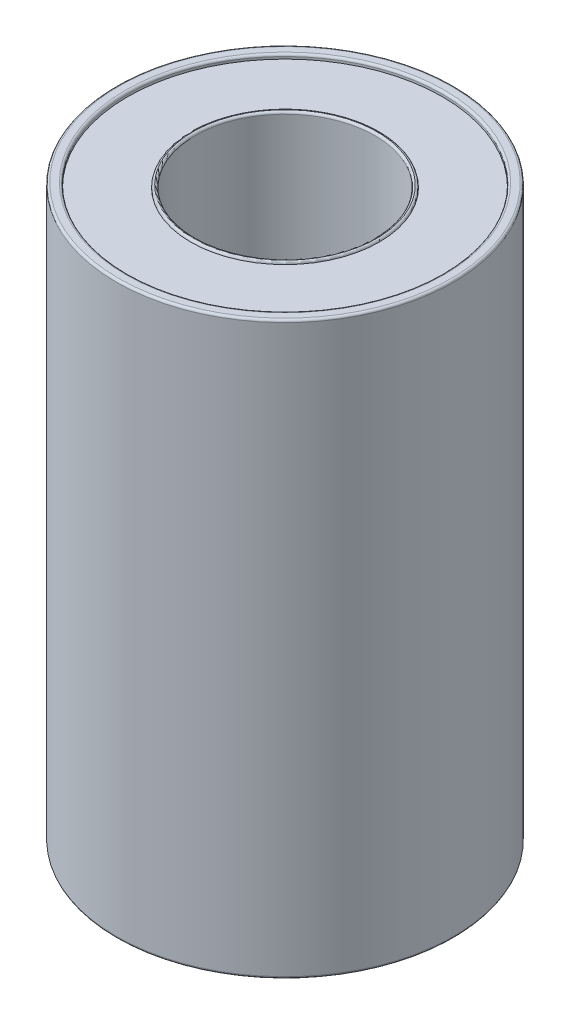
ISO-10303-21;
HEADER;
FILE_DESCRIPTION(('STEP AP214'),'2;1');
FILE_NAME('part.step','',(''),(''),'','','');
FILE_SCHEMA(('AUTOMOTIVE_DESIGN { 1 0 10303 214 1 1 1 1 }'));
ENDSEC;
DATA;
#1=APPLICATION_CONTEXT('core data for automotive mechanical design processes');
#2=APPLICATION_PROTOCOL_DEFINITION('international standard','automotive_design',2000,#1);
#3=PRODUCT_CONTEXT('',#1,'mechanical');
#4=PRODUCT('Part','Part','',(#3));
#5=PRODUCT_RELATED_PRODUCT_CATEGORY('part','',(#4));
#6=PRODUCT_DEFINITION_FORMATION('','',#4);
#7=PRODUCT_DEFINITION_CONTEXT('part definition',#1,'design');
#8=PRODUCT_DEFINITION('design','',#6,#7);
#9=PRODUCT_DEFINITION_SHAPE('','',#8);
#10=(LENGTH_UNIT() NAMED_UNIT(*) SI_UNIT(.MILLI.,.METRE.));
#11=(NAMED_UNIT(*) PLANE_ANGLE_UNIT() SI_UNIT($,.RADIAN.));
#12=(NAMED_UNIT(*) SI_UNIT($,.STERADIAN.) SOLID_ANGLE_UNIT());
#13=UNCERTAINTY_MEASURE_WITH_UNIT(LENGTH_MEASURE(1.E-05),#10,'distance_accuracy_value','');
#14=(GEOMETRIC_REPRESENTATION_CONTEXT(3) GLOBAL_UNCERTAINTY_ASSIGNED_CONTEXT((#13)) GLOBAL_UNIT_ASSIGNED_CONTEXT((#10,
#11,#12)) REPRESENTATION_CONTEXT('',''));
#15=CARTESIAN_POINT('',(0.,0.,0.));
#16=DIRECTION('',(0.,0.,1.));
#17=DIRECTION('',(1.,0.,0.));
#18=AXIS2_PLACEMENT_3D('',#15,#16,#17);
#19=CARTESIAN_POINT('',(0.,12.5,0.));
#20=DIRECTION('',(0.,1.,0.));
#21=DIRECTION('',(0.,0.,1.));
#22=AXIS2_PLACEMENT_3D('',#19,#20,#21);
#23=PLANE('',#22);
#24=CARTESIAN_POINT('',(0.,12.5,0.));
#25=DIRECTION('',(0.,1.,0.));
#26=DIRECTION('',(0.,0.,1.));
#27=AXIS2_PLACEMENT_3D('',#24,#25,#26);
#28=CIRCLE('',#27,7.);
#29=CARTESIAN_POINT('',(0.,12.5,7.));
#30=VERTEX_POINT('',#29);
#31=EDGE_CURVE('E83',#30,#30,#28,.F.);
#32=ORIENTED_EDGE('',*,*,#31,.F.);
#33=EDGE_LOOP('',(#32));
#34=FACE_BOUND('',#33,.T.);
#35=CARTESIAN_POINT('',(0.,12.5,0.));
#36=DIRECTION('',(0.,1.,0.));
#37=DIRECTION('',(0.,0.,1.));
#38=AXIS2_PLACEMENT_3D('',#35,#36,#37);
#39=CIRCLE('',#38,4.2);
#40=CARTESIAN_POINT('',(0.,12.5,4.2));
#41=VERTEX_POINT('',#40);
#42=EDGE_CURVE('E92',#41,#41,#39,.T.);
#43=ORIENTED_EDGE('',*,*,#42,.F.);
#44=EDGE_LOOP('',(#43));
#45=FACE_BOUND('',#44,.T.);
#46=ADVANCED_FACE('F37',(#34,#45),#23,.T.);
#47=CARTESIAN_POINT('',(0.,-12.5,0.));
#48=DIRECTION('',(0.,1.,0.));
#49=DIRECTION('',(0.,0.,1.));
#50=AXIS2_PLACEMENT_3D('',#47,#48,#49);
#51=PLANE('',#50);
#52=CARTESIAN_POINT('',(0.,-12.5,0.));
#53=DIRECTION('',(0.,1.,0.));
#54=DIRECTION('',(0.,0.,1.));
#55=AXIS2_PLACEMENT_3D('',#52,#53,#54);
#56=CIRCLE('',#55,4.2);
#57=CARTESIAN_POINT('',(0.,-12.5,4.2));
#58=VERTEX_POINT('',#57);
#59=EDGE_CURVE('E82',#58,#58,#56,.T.);
#60=ORIENTED_EDGE('',*,*,#59,.T.);
#61=EDGE_LOOP('',(#60));
#62=FACE_BOUND('',#61,.T.);
#63=CARTESIAN_POINT('',(0.,-12.5,0.));
#64=DIRECTION('',(0.,1.,0.));
#65=DIRECTION('',(0.,0.,1.));
#66=AXIS2_PLACEMENT_3D('',#63,#64,#65);
#67=CIRCLE('',#66,7.);
#68=CARTESIAN_POINT('',(0.,-12.5,7.));
#69=VERTEX_POINT('',#68);
#70=EDGE_CURVE('E96',#69,#69,#67,.T.);
#71=ORIENTED_EDGE('',*,*,#70,.F.);
#72=EDGE_LOOP('',(#71));
#73=FACE_BOUND('',#72,.T.);
#74=ADVANCED_FACE('F114',(#62,#73),#51,.F.);
#75=CARTESIAN_POINT('',(0.,-12.5,0.));
#76=DIRECTION('',(0.,1.,0.));
#77=DIRECTION('',(0.,0.,1.));
#78=AXIS2_PLACEMENT_3D('',#75,#76,#77);
#79=CYLINDRICAL_SURFACE('',#78,4.);
#80=CARTESIAN_POINT('',(0.,-12.5,0.));
#81=DIRECTION('',(0.,-1.,0.));
#82=DIRECTION('',(0.,0.,-1.));
#83=AXIS2_PLACEMENT_3D('',#80,#81,#82);
#84=CIRCLE('',#83,4.);
#85=CARTESIAN_POINT('',(0.,-12.5,-4.));
#86=VERTEX_POINT('',#85);
#87=EDGE_CURVE('E77',#86,#86,#84,.T.);
#88=ORIENTED_EDGE('',*,*,#87,.T.);
#89=EDGE_LOOP('',(#88));
#90=FACE_BOUND('',#89,.T.);
#91=CARTESIAN_POINT('',(0.,12.5,0.));
#92=DIRECTION('',(0.,1.,0.));
#93=DIRECTION('',(0.,0.,1.));
#94=AXIS2_PLACEMENT_3D('',#91,#92,#93);
#95=CIRCLE('',#94,4.);
#96=CARTESIAN_POINT('',(0.,12.5,4.));
#97=VERTEX_POINT('',#96);
#98=EDGE_CURVE('E87',#97,#97,#95,.T.);
#99=ORIENTED_EDGE('',*,*,#98,.T.);
#100=EDGE_LOOP('',(#99));
#101=FACE_BOUND('',#100,.T.);
#102=ADVANCED_FACE('F127',(#90,#101),#79,.F.);
#103=CARTESIAN_POINT('',(0.,12.5,0.));
#104=DIRECTION('',(0.,1.,0.));
#105=DIRECTION('',(0.,0.,1.));
#106=AXIS2_PLACEMENT_3D('',#103,#104,#105);
#107=TOROIDAL_SURFACE('',#106,4.1,0.1);
#108=ORIENTED_EDGE('',*,*,#98,.F.);
#109=EDGE_LOOP('',(#108));
#110=FACE_BOUND('',#109,.T.);
#111=CARTESIAN_POINT('',(0.,12.6,0.));
#112=DIRECTION('',(0.,1.,0.));
#113=DIRECTION('',(0.,0.,1.));
#114=AXIS2_PLACEMENT_3D('',#111,#112,#113);
#115=CIRCLE('',#114,4.1);
#116=CARTESIAN_POINT('',(0.,12.6,4.1));
#117=VERTEX_POINT('',#116);
#118=EDGE_CURVE('E88',#117,#117,#115,.F.);
#119=ORIENTED_EDGE('',*,*,#118,.F.);
#120=EDGE_LOOP('',(#119));
#121=FACE_BOUND('',#120,.T.);
#122=ADVANCED_FACE('F122',(#110,#121),#107,.T.);
#123=CARTESIAN_POINT('',(0.,12.5,0.));
#124=DIRECTION('',(0.,1.,0.));
#125=DIRECTION('',(0.,0.,1.));
#126=AXIS2_PLACEMENT_3D('',#123,#124,#125);
#127=TOROIDAL_SURFACE('',#126,4.1,0.1);
#128=ORIENTED_EDGE('',*,*,#42,.T.);
#129=EDGE_LOOP('',(#128));
#130=FACE_BOUND('',#129,.T.);
#131=ORIENTED_EDGE('',*,*,#118,.T.);
#132=EDGE_LOOP('',(#131));
#133=FACE_BOUND('',#132,.T.);
#134=ADVANCED_FACE('F118',(#130,#133),#127,.T.);
#135=CARTESIAN_POINT('',(0.,-12.5,0.));
#136=DIRECTION('',(0.,-1.,0.));
#137=DIRECTION('',(0.,0.,-1.));
#138=AXIS2_PLACEMENT_3D('',#135,#136,#137);
#139=TOROIDAL_SURFACE('',#138,4.1,0.1);
#140=ORIENTED_EDGE('',*,*,#87,.F.);
#141=EDGE_LOOP('',(#140));
#142=FACE_BOUND('',#141,.T.);
#143=CARTESIAN_POINT('',(0.,-12.6,0.));
#144=DIRECTION('',(0.,-1.,0.));
#145=DIRECTION('',(0.,0.,-1.));
#146=AXIS2_PLACEMENT_3D('',#143,#144,#145);
#147=CIRCLE('',#146,4.1);
#148=CARTESIAN_POINT('',(0.,-12.6,-4.1));
#149=VERTEX_POINT('',#148);
#150=EDGE_CURVE('E78',#149,#149,#147,.F.);
#151=ORIENTED_EDGE('',*,*,#150,.F.);
#152=EDGE_LOOP('',(#151));
#153=FACE_BOUND('',#152,.T.);
#154=ADVANCED_FACE('F121',(#142,#153),#139,.T.);
#155=CARTESIAN_POINT('',(0.,-12.5,0.));
#156=DIRECTION('',(0.,-1.,0.));
#157=DIRECTION('',(0.,0.,-1.));
#158=AXIS2_PLACEMENT_3D('',#155,#156,#157);
#159=TOROIDAL_SURFACE('',#158,4.1,0.1);
#160=ORIENTED_EDGE('',*,*,#150,.T.);
#161=EDGE_LOOP('',(#160));
#162=FACE_BOUND('',#161,.T.);
#163=ORIENTED_EDGE('',*,*,#59,.F.);
#164=EDGE_LOOP('',(#163));
#165=FACE_BOUND('',#164,.T.);
#166=ADVANCED_FACE('F138',(#162,#165),#159,.T.);
#167=CARTESIAN_POINT('',(0.,12.7,0.));
#168=DIRECTION('',(0.,-1.,0.));
#169=DIRECTION('',(0.,0.,-1.));
#170=AXIS2_PLACEMENT_3D('',#167,#168,#169);
#171=CYLINDRICAL_SURFACE('',#170,7.);
#172=CARTESIAN_POINT('',(0.,-12.6,0.));
#173=DIRECTION('',(0.,1.,0.));
#174=DIRECTION('',(0.,0.,1.));
#175=AXIS2_PLACEMENT_3D('',#172,#173,#174);
#176=CIRCLE('',#175,7.);
#177=CARTESIAN_POINT('',(0.,-12.6,7.));
#178=VERTEX_POINT('',#177);
#179=EDGE_CURVE('E45',#178,#178,#176,.F.);
#180=ORIENTED_EDGE('',*,*,#179,.T.);
#181=EDGE_LOOP('',(#180));
#182=FACE_BOUND('',#181,.T.);
#183=ORIENTED_EDGE('',*,*,#70,.T.);
#184=EDGE_LOOP('',(#183));
#185=FACE_BOUND('',#184,.T.);
#186=ADVANCED_FACE('F141',(#182,#185),#171,.F.);
#187=CARTESIAN_POINT('',(0.,12.7,0.));
#188=DIRECTION('',(0.,1.,0.));
#189=DIRECTION('',(0.,0.,1.));
#190=AXIS2_PLACEMENT_3D('',#187,#188,#189);
#191=PLANE('',#190);
#192=CARTESIAN_POINT('',(0.,12.7,0.));
#193=DIRECTION('',(0.,1.,0.));
#194=DIRECTION('',(0.,0.,1.));
#195=AXIS2_PLACEMENT_3D('',#192,#193,#194);
#196=CIRCLE('',#195,7.4);
#197=CARTESIAN_POINT('',(0.,12.7,7.4));
#198=VERTEX_POINT('',#197);
#199=EDGE_CURVE('E69',#198,#198,#196,.T.);
#200=ORIENTED_EDGE('',*,*,#199,.T.);
#201=EDGE_LOOP('',(#200));
#202=FACE_BOUND('',#201,.T.);
#203=CARTESIAN_POINT('',(0.,12.7,0.));
#204=DIRECTION('',(0.,1.,0.));
#205=DIRECTION('',(0.,0.,1.));
#206=AXIS2_PLACEMENT_3D('',#203,#204,#205);
#207=CIRCLE('',#206,7.1);
#208=CARTESIAN_POINT('',(0.,12.7,7.1));
#209=VERTEX_POINT('',#208);
#210=EDGE_CURVE('E73',#209,#209,#207,.F.);
#211=ORIENTED_EDGE('',*,*,#210,.T.);
#212=EDGE_LOOP('',(#211));
#213=FACE_BOUND('',#212,.T.);
#214=ADVANCED_FACE('F167',(#202,#213),#191,.T.);
#215=CARTESIAN_POINT('',(0.,-12.7,0.));
#216=DIRECTION('',(0.,1.,0.));
#217=DIRECTION('',(0.,0.,1.));
#218=AXIS2_PLACEMENT_3D('',#215,#216,#217);
#219=PLANE('',#218);
#220=CARTESIAN_POINT('',(0.,-12.7,0.));
#221=DIRECTION('',(0.,1.,0.));
#222=DIRECTION('',(0.,0.,1.));
#223=AXIS2_PLACEMENT_3D('',#220,#221,#222);
#224=CIRCLE('',#223,7.1);
#225=CARTESIAN_POINT('',(0.,-12.7,7.1));
#226=VERTEX_POINT('',#225);
#227=EDGE_CURVE('E50',#226,#226,#224,.T.);
#228=ORIENTED_EDGE('',*,*,#227,.T.);
#229=EDGE_LOOP('',(#228));
#230=FACE_BOUND('',#229,.T.);
#231=CARTESIAN_POINT('',(0.,-12.7,0.));
#232=DIRECTION('',(0.,1.,0.));
#233=DIRECTION('',(0.,0.,1.));
#234=AXIS2_PLACEMENT_3D('',#231,#232,#233);
#235=CIRCLE('',#234,7.4);
#236=CARTESIAN_POINT('',(0.,-12.7,7.4));
#237=VERTEX_POINT('',#236);
#238=EDGE_CURVE('E55',#237,#237,#235,.F.);
#239=ORIENTED_EDGE('',*,*,#238,.T.);
#240=EDGE_LOOP('',(#239));
#241=FACE_BOUND('',#240,.T.);
#242=ADVANCED_FACE('F163',(#230,#241),#219,.F.);
#243=CARTESIAN_POINT('',(0.,12.7,0.));
#244=DIRECTION('',(0.,-1.,0.));
#245=DIRECTION('',(0.,0.,-1.));
#246=AXIS2_PLACEMENT_3D('',#243,#244,#245);
#247=CYLINDRICAL_SURFACE('',#246,7.5);
#248=CARTESIAN_POINT('',(0.,-12.6,0.));
#249=DIRECTION('',(0.,1.,0.));
#250=DIRECTION('',(0.,0.,1.));
#251=AXIS2_PLACEMENT_3D('',#248,#249,#250);
#252=CIRCLE('',#251,7.5);
#253=CARTESIAN_POINT('',(0.,-12.6,7.5));
#254=VERTEX_POINT('',#253);
#255=EDGE_CURVE('E10',#254,#254,#252,.T.);
#256=ORIENTED_EDGE('',*,*,#255,.T.);
#257=EDGE_LOOP('',(#256));
#258=FACE_BOUND('',#257,.T.);
#259=CARTESIAN_POINT('',(0.,12.6,0.));
#260=DIRECTION('',(0.,1.,0.));
#261=DIRECTION('',(0.,0.,1.));
#262=AXIS2_PLACEMENT_3D('',#259,#260,#261);
#263=CIRCLE('',#262,7.5);
#264=CARTESIAN_POINT('',(0.,12.6,7.5));
#265=VERTEX_POINT('',#264);
#266=EDGE_CURVE('E65',#265,#265,#263,.F.);
#267=ORIENTED_EDGE('',*,*,#266,.T.);
#268=EDGE_LOOP('',(#267));
#269=FACE_BOUND('',#268,.T.);
#270=ADVANCED_FACE('F166',(#258,#269),#247,.T.);
#271=CARTESIAN_POINT('',(0.,12.6,0.));
#272=DIRECTION('',(0.,1.,0.));
#273=DIRECTION('',(0.,0.,1.));
#274=AXIS2_PLACEMENT_3D('',#271,#272,#273);
#275=CIRCLE('',#274,7.);
#276=CARTESIAN_POINT('',(0.,12.6,7.));
#277=VERTEX_POINT('',#276);
#278=EDGE_CURVE('E61',#277,#277,#275,.T.);
#279=ORIENTED_EDGE('',*,*,#278,.T.);
#280=EDGE_LOOP('',(#279));
#281=FACE_BOUND('',#280,.T.);
#282=ORIENTED_EDGE('',*,*,#31,.T.);
#283=EDGE_LOOP('',(#282));
#284=FACE_BOUND('',#283,.T.);
#285=ADVANCED_FACE('F110',(#281,#284),#171,.F.);
#286=CARTESIAN_POINT('',(0.,12.6,0.));
#287=DIRECTION('',(0.,1.,0.));
#288=DIRECTION('',(0.,0.,1.));
#289=AXIS2_PLACEMENT_3D('',#286,#287,#288);
#290=TOROIDAL_SURFACE('',#289,7.4,0.1);
#291=ORIENTED_EDGE('',*,*,#266,.F.);
#292=EDGE_LOOP('',(#291));
#293=FACE_BOUND('',#292,.T.);
#294=ORIENTED_EDGE('',*,*,#199,.F.);
#295=EDGE_LOOP('',(#294));
#296=FACE_BOUND('',#295,.T.);
#297=ADVANCED_FACE('F146',(#293,#296),#290,.T.);
#298=CARTESIAN_POINT('',(0.,12.6,0.));
#299=DIRECTION('',(0.,1.,0.));
#300=DIRECTION('',(0.,0.,1.));
#301=AXIS2_PLACEMENT_3D('',#298,#299,#300);
#302=TOROIDAL_SURFACE('',#301,7.1,0.1);
#303=ORIENTED_EDGE('',*,*,#210,.F.);
#304=EDGE_LOOP('',(#303));
#305=FACE_BOUND('',#304,.T.);
#306=ORIENTED_EDGE('',*,*,#278,.F.);
#307=EDGE_LOOP('',(#306));
#308=FACE_BOUND('',#307,.T.);
#309=ADVANCED_FACE('F149',(#305,#308),#302,.T.);
#310=CARTESIAN_POINT('',(0.,-12.6,0.));
#311=DIRECTION('',(0.,1.,0.));
#312=DIRECTION('',(0.,0.,1.));
#313=AXIS2_PLACEMENT_3D('',#310,#311,#312);
#314=TOROIDAL_SURFACE('',#313,7.1,0.1);
#315=ORIENTED_EDGE('',*,*,#179,.F.);
#316=EDGE_LOOP('',(#315));
#317=FACE_BOUND('',#316,.T.);
#318=ORIENTED_EDGE('',*,*,#227,.F.);
#319=EDGE_LOOP('',(#318));
#320=FACE_BOUND('',#319,.T.);
#321=ADVANCED_FACE('F152',(#317,#320),#314,.T.);
#322=CARTESIAN_POINT('',(0.,-12.6,0.));
#323=DIRECTION('',(0.,1.,0.));
#324=DIRECTION('',(0.,0.,1.));
#325=AXIS2_PLACEMENT_3D('',#322,#323,#324);
#326=TOROIDAL_SURFACE('',#325,7.4,0.1);
#327=ORIENTED_EDGE('',*,*,#238,.F.);
#328=EDGE_LOOP('',(#327));
#329=FACE_BOUND('',#328,.T.);
#330=ORIENTED_EDGE('',*,*,#255,.F.);
#331=EDGE_LOOP('',(#330));
#332=FACE_BOUND('',#331,.T.);
#333=ADVANCED_FACE('F39',(#329,#332),#326,.T.);
#334=CLOSED_SHELL('',(#46,#74,#102,#122,#134,#154,#166,#186,#214,#242,#270,#285,#297,#309,#321,#333));
#335=MANIFOLD_SOLID_BREP('B2',#334);
#336=ADVANCED_BREP_SHAPE_REPRESENTATION('',(#18,#335),#14);
#337=SHAPE_DEFINITION_REPRESENTATION(#9,#336);
ENDSEC;
END-ISO-10303-21;
